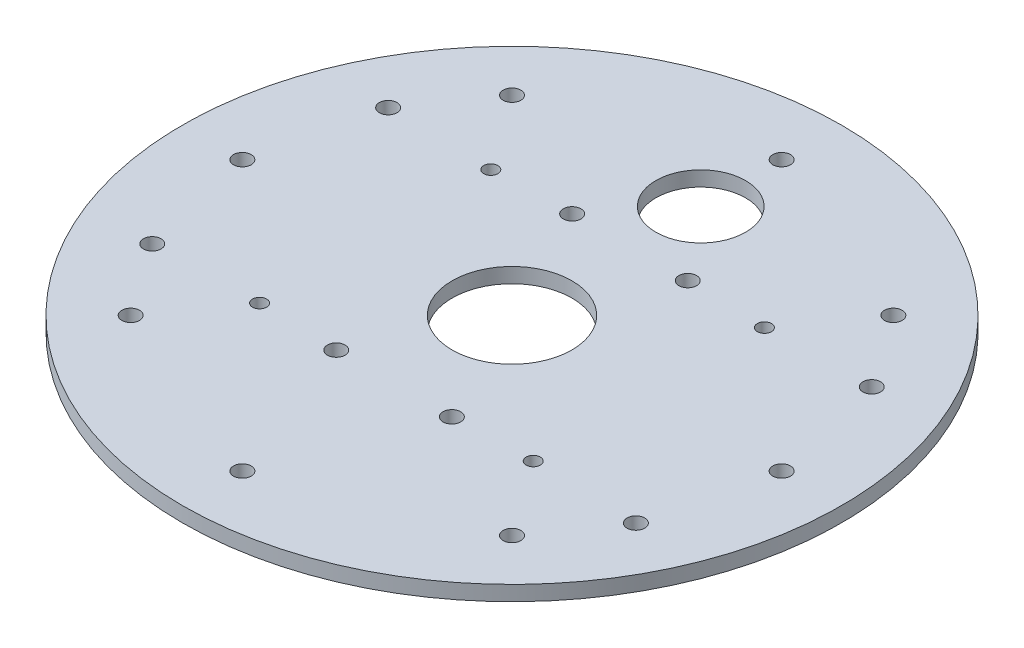
ISO-10303-21;
HEADER;
FILE_DESCRIPTION(('STEP AP214'),'2;1');
FILE_NAME('part.step','',(''),(''),'','','');
FILE_SCHEMA(('AUTOMOTIVE_DESIGN { 1 0 10303 214 1 1 1 1 }'));
ENDSEC;
DATA;
#1=APPLICATION_CONTEXT('core data for automotive mechanical design processes');
#2=APPLICATION_PROTOCOL_DEFINITION('international standard','automotive_design',2000,#1);
#3=PRODUCT_CONTEXT('',#1,'mechanical');
#4=PRODUCT('Part','Part','',(#3));
#5=PRODUCT_RELATED_PRODUCT_CATEGORY('part','',(#4));
#6=PRODUCT_DEFINITION_FORMATION('','',#4);
#7=PRODUCT_DEFINITION_CONTEXT('part definition',#1,'design');
#8=PRODUCT_DEFINITION('design','',#6,#7);
#9=PRODUCT_DEFINITION_SHAPE('','',#8);
#10=(LENGTH_UNIT() NAMED_UNIT(*) SI_UNIT(.MILLI.,.METRE.));
#11=(NAMED_UNIT(*) PLANE_ANGLE_UNIT() SI_UNIT($,.RADIAN.));
#12=(NAMED_UNIT(*) SI_UNIT($,.STERADIAN.) SOLID_ANGLE_UNIT());
#13=UNCERTAINTY_MEASURE_WITH_UNIT(LENGTH_MEASURE(1.E-05),#10,'distance_accuracy_value','');
#14=(GEOMETRIC_REPRESENTATION_CONTEXT(3) GLOBAL_UNCERTAINTY_ASSIGNED_CONTEXT((#13)) GLOBAL_UNIT_ASSIGNED_CONTEXT((#10,
#11,#12)) REPRESENTATION_CONTEXT('',''));
#15=CARTESIAN_POINT('',(0.,0.,0.));
#16=DIRECTION('',(0.,0.,1.));
#17=DIRECTION('',(1.,0.,0.));
#18=AXIS2_PLACEMENT_3D('',#15,#16,#17);
#19=CARTESIAN_POINT('',(0.,3.175,0.));
#20=DIRECTION('',(0.,-1.,0.));
#21=DIRECTION('',(0.,0.,-1.));
#22=AXIS2_PLACEMENT_3D('',#19,#20,#21);
#23=CYLINDRICAL_SURFACE('',#22,69.85);
#24=CARTESIAN_POINT('',(0.,3.175,0.));
#25=DIRECTION('',(0.,1.,0.));
#26=DIRECTION('',(0.,0.,1.));
#27=AXIS2_PLACEMENT_3D('',#24,#25,#26);
#28=CIRCLE('',#27,69.85);
#29=CARTESIAN_POINT('',(0.,3.175,69.85));
#30=VERTEX_POINT('',#29);
#31=EDGE_CURVE('E10',#30,#30,#28,.T.);
#32=ORIENTED_EDGE('',*,*,#31,.F.);
#33=EDGE_LOOP('',(#32));
#34=FACE_BOUND('',#33,.T.);
#35=CARTESIAN_POINT('',(0.,0.,0.));
#36=DIRECTION('',(0.,1.,0.));
#37=DIRECTION('',(0.,0.,1.));
#38=AXIS2_PLACEMENT_3D('',#35,#36,#37);
#39=CIRCLE('',#38,69.85);
#40=CARTESIAN_POINT('',(0.,0.,69.85));
#41=VERTEX_POINT('',#40);
#42=EDGE_CURVE('E34',#41,#41,#39,.T.);
#43=ORIENTED_EDGE('',*,*,#42,.T.);
#44=EDGE_LOOP('',(#43));
#45=FACE_BOUND('',#44,.T.);
#46=ADVANCED_FACE('F31',(#34,#45),#23,.T.);
#47=CARTESIAN_POINT('',(0.,3.175,0.));
#48=DIRECTION('',(0.,1.,0.));
#49=DIRECTION('',(0.,0.,1.));
#50=AXIS2_PLACEMENT_3D('',#47,#48,#49);
#51=PLANE('',#50);
#52=CARTESIAN_POINT('',(40.4111525448107,3.175,40.4111525448117));
#53=DIRECTION('',(0.,1.,0.));
#54=DIRECTION('',(0.,0.,1.));
#55=AXIS2_PLACEMENT_3D('',#52,#53,#54);
#56=CIRCLE('',#55,1.875);
#57=CARTESIAN_POINT('',(40.4111525448107,3.175,42.2861525448117));
#58=VERTEX_POINT('',#57);
#59=EDGE_CURVE('E140',#58,#58,#56,.F.);
#60=ORIENTED_EDGE('',*,*,#59,.T.);
#61=EDGE_LOOP('',(#60));
#62=FACE_BOUND('',#61,.T.);
#63=CARTESIAN_POINT('',(-29.,3.175,24.5));
#64=DIRECTION('',(0.,1.,0.));
#65=DIRECTION('',(0.,0.,1.));
#66=AXIS2_PLACEMENT_3D('',#63,#64,#65);
#67=CIRCLE('',#66,1.5);
#68=CARTESIAN_POINT('',(-29.,3.175,26.));
#69=VERTEX_POINT('',#68);
#70=EDGE_CURVE('E134',#69,#69,#67,.F.);
#71=ORIENTED_EDGE('',*,*,#70,.T.);
#72=EDGE_LOOP('',(#71));
#73=FACE_BOUND('',#72,.T.);
#74=CARTESIAN_POINT('',(5.26590217392525E-12,3.175,-57.1500000000019));
#75=DIRECTION('',(0.,1.,0.));
#76=DIRECTION('',(0.,0.,1.));
#77=AXIS2_PLACEMENT_3D('',#74,#75,#76);
#78=CIRCLE('',#77,1.875);
#79=CARTESIAN_POINT('',(5.26590217392525E-12,3.175,-55.2750000000019));
#80=VERTEX_POINT('',#79);
#81=EDGE_CURVE('E128',#80,#80,#78,.F.);
#82=ORIENTED_EDGE('',*,*,#81,.T.);
#83=EDGE_LOOP('',(#82));
#84=FACE_BOUND('',#83,.T.);
#85=CARTESIAN_POINT('',(-40.4111525448069,3.175,-40.4111525448155));
#86=DIRECTION('',(0.,1.,0.));
#87=DIRECTION('',(0.,0.,1.));
#88=AXIS2_PLACEMENT_3D('',#85,#86,#87);
#89=CIRCLE('',#88,1.875);
#90=CARTESIAN_POINT('',(-40.4111525448069,3.175,-38.5361525448155));
#91=VERTEX_POINT('',#90);
#92=EDGE_CURVE('E122',#91,#91,#89,.F.);
#93=ORIENTED_EDGE('',*,*,#92,.T.);
#94=EDGE_LOOP('',(#93));
#95=FACE_BOUND('',#94,.T.);
#96=CARTESIAN_POINT('',(-57.1499999999981,3.175,-5.27240738696016E-12));
#97=DIRECTION('',(0.,1.,0.));
#98=DIRECTION('',(0.,0.,1.));
#99=AXIS2_PLACEMENT_3D('',#96,#97,#98);
#100=CIRCLE('',#99,1.875);
#101=CARTESIAN_POINT('',(-57.1499999999981,3.175,1.87499999999473));
#102=VERTEX_POINT('',#101);
#103=EDGE_CURVE('E115',#102,#102,#100,.F.);
#104=ORIENTED_EDGE('',*,*,#103,.T.);
#105=EDGE_LOOP('',(#104));
#106=FACE_BOUND('',#105,.T.);
#107=CARTESIAN_POINT('',(-40.4111525448117,3.175,40.4111525448069));
#108=DIRECTION('',(0.,1.,0.));
#109=DIRECTION('',(0.,0.,1.));
#110=AXIS2_PLACEMENT_3D('',#107,#108,#109);
#111=CIRCLE('',#110,1.875);
#112=CARTESIAN_POINT('',(-40.4111525448117,3.175,42.2861525448069));
#113=VERTEX_POINT('',#112);
#114=EDGE_CURVE('E169',#113,#113,#111,.F.);
#115=ORIENTED_EDGE('',*,*,#114,.T.);
#116=EDGE_LOOP('',(#115));
#117=FACE_BOUND('',#116,.T.);
#118=CARTESIAN_POINT('',(-1.50372063540055E-12,3.175,57.1499999999981));
#119=DIRECTION('',(0.,1.,0.));
#120=DIRECTION('',(0.,0.,1.));
#121=AXIS2_PLACEMENT_3D('',#118,#119,#120);
#122=CIRCLE('',#121,1.875);
#123=CARTESIAN_POINT('',(-1.50372063540055E-12,3.175,59.0249999999981));
#124=VERTEX_POINT('',#123);
#125=EDGE_CURVE('E163',#124,#124,#122,.F.);
#126=ORIENTED_EDGE('',*,*,#125,.T.);
#127=EDGE_LOOP('',(#126));
#128=FACE_BOUND('',#127,.T.);
#129=CARTESIAN_POINT('',(29.,3.175,24.5));
#130=DIRECTION('',(0.,1.,0.));
#131=DIRECTION('',(0.,0.,1.));
#132=AXIS2_PLACEMENT_3D('',#129,#130,#131);
#133=CIRCLE('',#132,1.5);
#134=CARTESIAN_POINT('',(29.,3.175,26.));
#135=VERTEX_POINT('',#134);
#136=EDGE_CURVE('E157',#135,#135,#133,.F.);
#137=ORIENTED_EDGE('',*,*,#136,.T.);
#138=EDGE_LOOP('',(#137));
#139=FACE_BOUND('',#138,.T.);
#140=CARTESIAN_POINT('',(29.,3.175,-24.5));
#141=DIRECTION('',(0.,1.,0.));
#142=DIRECTION('',(0.,0.,1.));
#143=AXIS2_PLACEMENT_3D('',#140,#141,#142);
#144=CIRCLE('',#143,1.5);
#145=CARTESIAN_POINT('',(29.,3.175,-23.));
#146=VERTEX_POINT('',#145);
#147=EDGE_CURVE('E151',#146,#146,#144,.F.);
#148=ORIENTED_EDGE('',*,*,#147,.T.);
#149=EDGE_LOOP('',(#148));
#150=FACE_BOUND('',#149,.T.);
#151=CARTESIAN_POINT('',(0.,3.175,-40.));
#152=DIRECTION('',(0.,1.,0.));
#153=DIRECTION('',(0.,0.,1.));
#154=AXIS2_PLACEMENT_3D('',#151,#152,#153);
#155=CIRCLE('',#154,9.5);
#156=CARTESIAN_POINT('',(0.,3.175,-30.5));
#157=VERTEX_POINT('',#156);
#158=EDGE_CURVE('E145',#157,#157,#155,.F.);
#159=ORIENTED_EDGE('',*,*,#158,.T.);
#160=EDGE_LOOP('',(#159));
#161=FACE_BOUND('',#160,.T.);
#162=CARTESIAN_POINT('',(12.25,3.175,-25.));
#163=DIRECTION('',(0.,1.,0.));
#164=DIRECTION('',(0.,0.,1.));
#165=AXIS2_PLACEMENT_3D('',#162,#163,#164);
#166=CIRCLE('',#165,1.875);
#167=CARTESIAN_POINT('',(12.25,3.175,-23.125));
#168=VERTEX_POINT('',#167);
#169=EDGE_CURVE('E62',#168,#168,#166,.F.);
#170=ORIENTED_EDGE('',*,*,#169,.T.);
#171=EDGE_LOOP('',(#170));
#172=FACE_BOUND('',#171,.T.);
#173=CARTESIAN_POINT('',(51.2500000000002,3.175,-25.));
#174=DIRECTION('',(0.,1.,0.));
#175=DIRECTION('',(0.,0.,1.));
#176=AXIS2_PLACEMENT_3D('',#173,#174,#175);
#177=CIRCLE('',#176,1.875);
#178=CARTESIAN_POINT('',(51.2500000000002,3.175,-23.125));
#179=VERTEX_POINT('',#178);
#180=EDGE_CURVE('E55',#179,#179,#177,.F.);
#181=ORIENTED_EDGE('',*,*,#180,.T.);
#182=EDGE_LOOP('',(#181));
#183=FACE_BOUND('',#182,.T.);
#184=CARTESIAN_POINT('',(51.2500000000002,3.175,25.));
#185=DIRECTION('',(0.,1.,0.));
#186=DIRECTION('',(0.,0.,1.));
#187=AXIS2_PLACEMENT_3D('',#184,#185,#186);
#188=CIRCLE('',#187,1.875);
#189=CARTESIAN_POINT('',(51.2500000000002,3.175,26.875));
#190=VERTEX_POINT('',#189);
#191=EDGE_CURVE('E82',#190,#190,#188,.F.);
#192=ORIENTED_EDGE('',*,*,#191,.T.);
#193=EDGE_LOOP('',(#192));
#194=FACE_BOUND('',#193,.T.);
#195=CARTESIAN_POINT('',(12.25,3.175,25.));
#196=DIRECTION('',(0.,1.,0.));
#197=DIRECTION('',(0.,0.,1.));
#198=AXIS2_PLACEMENT_3D('',#195,#196,#197);
#199=CIRCLE('',#198,1.875);
#200=CARTESIAN_POINT('',(12.25,3.175,26.875));
#201=VERTEX_POINT('',#200);
#202=EDGE_CURVE('E76',#201,#201,#199,.F.);
#203=ORIENTED_EDGE('',*,*,#202,.T.);
#204=EDGE_LOOP('',(#203));
#205=FACE_BOUND('',#204,.T.);
#206=CARTESIAN_POINT('',(40.4111525448155,3.175,-40.4111525448107));
#207=DIRECTION('',(0.,1.,0.));
#208=DIRECTION('',(0.,0.,1.));
#209=AXIS2_PLACEMENT_3D('',#206,#207,#208);
#210=CIRCLE('',#209,1.875);
#211=CARTESIAN_POINT('',(40.4111525448155,3.175,-38.5361525448107));
#212=VERTEX_POINT('',#211);
#213=EDGE_CURVE('E69',#212,#212,#210,.F.);
#214=ORIENTED_EDGE('',*,*,#213,.T.);
#215=EDGE_LOOP('',(#214));
#216=FACE_BOUND('',#215,.T.);
#217=CARTESIAN_POINT('',(-29.,3.175,-24.5));
#218=DIRECTION('',(0.,1.,0.));
#219=DIRECTION('',(0.,0.,1.));
#220=AXIS2_PLACEMENT_3D('',#217,#218,#219);
#221=CIRCLE('',#220,1.5);
#222=CARTESIAN_POINT('',(-29.,3.175,-23.));
#223=VERTEX_POINT('',#222);
#224=EDGE_CURVE('E87',#223,#223,#221,.F.);
#225=ORIENTED_EDGE('',*,*,#224,.T.);
#226=EDGE_LOOP('',(#225));
#227=FACE_BOUND('',#226,.T.);
#228=CARTESIAN_POINT('',(-51.2500000000002,3.175,-25.));
#229=DIRECTION('',(0.,1.,0.));
#230=DIRECTION('',(0.,0.,1.));
#231=AXIS2_PLACEMENT_3D('',#228,#229,#230);
#232=CIRCLE('',#231,1.875);
#233=CARTESIAN_POINT('',(-51.2500000000002,3.175,-23.125));
#234=VERTEX_POINT('',#233);
#235=EDGE_CURVE('E100',#234,#234,#232,.F.);
#236=ORIENTED_EDGE('',*,*,#235,.T.);
#237=EDGE_LOOP('',(#236));
#238=FACE_BOUND('',#237,.T.);
#239=CARTESIAN_POINT('',(-12.25,3.175,-25.));
#240=DIRECTION('',(0.,1.,0.));
#241=DIRECTION('',(0.,0.,1.));
#242=AXIS2_PLACEMENT_3D('',#239,#240,#241);
#243=CIRCLE('',#242,1.875);
#244=CARTESIAN_POINT('',(-12.25,3.175,-23.125));
#245=VERTEX_POINT('',#244);
#246=EDGE_CURVE('E68',#245,#245,#243,.F.);
#247=ORIENTED_EDGE('',*,*,#246,.T.);
#248=EDGE_LOOP('',(#247));
#249=FACE_BOUND('',#248,.T.);
#250=CARTESIAN_POINT('',(-51.2500000000002,3.175,25.));
#251=DIRECTION('',(0.,1.,0.));
#252=DIRECTION('',(0.,0.,1.));
#253=AXIS2_PLACEMENT_3D('',#250,#251,#252);
#254=CIRCLE('',#253,1.875);
#255=CARTESIAN_POINT('',(-51.2500000000002,3.175,26.875));
#256=VERTEX_POINT('',#255);
#257=EDGE_CURVE('E94',#256,#256,#254,.F.);
#258=ORIENTED_EDGE('',*,*,#257,.T.);
#259=EDGE_LOOP('',(#258));
#260=FACE_BOUND('',#259,.T.);
#261=CARTESIAN_POINT('',(-12.25,3.175,25.));
#262=DIRECTION('',(0.,1.,0.));
#263=DIRECTION('',(0.,0.,1.));
#264=AXIS2_PLACEMENT_3D('',#261,#262,#263);
#265=CIRCLE('',#264,1.875);
#266=CARTESIAN_POINT('',(-12.25,3.175,26.875));
#267=VERTEX_POINT('',#266);
#268=EDGE_CURVE('E110',#267,#267,#265,.F.);
#269=ORIENTED_EDGE('',*,*,#268,.T.);
#270=EDGE_LOOP('',(#269));
#271=FACE_BOUND('',#270,.T.);
#272=CARTESIAN_POINT('',(57.1500000000019,3.175,1.48628345681095E-12));
#273=DIRECTION('',(0.,1.,0.));
#274=DIRECTION('',(0.,0.,1.));
#275=AXIS2_PLACEMENT_3D('',#272,#273,#274);
#276=CIRCLE('',#275,1.875);
#277=CARTESIAN_POINT('',(57.1500000000019,3.175,1.87500000000149));
#278=VERTEX_POINT('',#277);
#279=EDGE_CURVE('E49',#278,#278,#276,.F.);
#280=ORIENTED_EDGE('',*,*,#279,.T.);
#281=EDGE_LOOP('',(#280));
#282=FACE_BOUND('',#281,.T.);
#283=CARTESIAN_POINT('',(0.,3.175,0.));
#284=DIRECTION('',(0.,1.,0.));
#285=DIRECTION('',(0.,0.,1.));
#286=AXIS2_PLACEMENT_3D('',#283,#284,#285);
#287=CIRCLE('',#286,12.7);
#288=CARTESIAN_POINT('',(0.,3.175,12.7));
#289=VERTEX_POINT('',#288);
#290=EDGE_CURVE('E43',#289,#289,#287,.F.);
#291=ORIENTED_EDGE('',*,*,#290,.T.);
#292=EDGE_LOOP('',(#291));
#293=FACE_BOUND('',#292,.T.);
#294=ORIENTED_EDGE('',*,*,#31,.T.);
#295=EDGE_LOOP('',(#294));
#296=FACE_BOUND('',#295,.T.);
#297=ADVANCED_FACE('F181',(#62,#73,#84,#95,#106,#117,#128,#139,#150,#161,#172,#183,#194,#205,
#216,#227,#238,#249,#260,#271,#282,#293,#296),#51,.T.);
#298=CARTESIAN_POINT('',(0.,0.,0.));
#299=DIRECTION('',(0.,1.,0.));
#300=DIRECTION('',(0.,0.,1.));
#301=AXIS2_PLACEMENT_3D('',#298,#299,#300);
#302=PLANE('',#301);
#303=CARTESIAN_POINT('',(40.4111525448107,0.,40.4111525448117));
#304=DIRECTION('',(0.,-1.,0.));
#305=DIRECTION('',(0.,0.,-1.));
#306=AXIS2_PLACEMENT_3D('',#303,#304,#305);
#307=CIRCLE('',#306,1.875);
#308=CARTESIAN_POINT('',(40.4111525448107,0.,38.5361525448117));
#309=VERTEX_POINT('',#308);
#310=EDGE_CURVE('E73',#309,#309,#307,.T.);
#311=ORIENTED_EDGE('',*,*,#310,.F.);
#312=EDGE_LOOP('',(#311));
#313=FACE_BOUND('',#312,.T.);
#314=CARTESIAN_POINT('',(-29.,0.,24.5));
#315=DIRECTION('',(0.,-1.,0.));
#316=DIRECTION('',(0.,0.,1.));
#317=AXIS2_PLACEMENT_3D('',#314,#315,#316);
#318=CIRCLE('',#317,1.5);
#319=CARTESIAN_POINT('',(-29.,0.,26.));
#320=VERTEX_POINT('',#319);
#321=EDGE_CURVE('E137',#320,#320,#318,.T.);
#322=ORIENTED_EDGE('',*,*,#321,.F.);
#323=EDGE_LOOP('',(#322));
#324=FACE_BOUND('',#323,.T.);
#325=CARTESIAN_POINT('',(5.26590217392525E-12,0.,-57.1500000000019));
#326=DIRECTION('',(0.,-1.,0.));
#327=DIRECTION('',(0.,0.,-1.));
#328=AXIS2_PLACEMENT_3D('',#325,#326,#327);
#329=CIRCLE('',#328,1.875);
#330=CARTESIAN_POINT('',(5.26590217392525E-12,0.,-59.0250000000019));
#331=VERTEX_POINT('',#330);
#332=EDGE_CURVE('E131',#331,#331,#329,.T.);
#333=ORIENTED_EDGE('',*,*,#332,.F.);
#334=EDGE_LOOP('',(#333));
#335=FACE_BOUND('',#334,.T.);
#336=CARTESIAN_POINT('',(-40.4111525448069,0.,-40.4111525448155));
#337=DIRECTION('',(0.,-1.,0.));
#338=DIRECTION('',(0.,0.,-1.));
#339=AXIS2_PLACEMENT_3D('',#336,#337,#338);
#340=CIRCLE('',#339,1.875);
#341=CARTESIAN_POINT('',(-40.4111525448069,0.,-42.2861525448155));
#342=VERTEX_POINT('',#341);
#343=EDGE_CURVE('E125',#342,#342,#340,.T.);
#344=ORIENTED_EDGE('',*,*,#343,.F.);
#345=EDGE_LOOP('',(#344));
#346=FACE_BOUND('',#345,.T.);
#347=CARTESIAN_POINT('',(-57.1499999999981,0.,-5.27240738696016E-12));
#348=DIRECTION('',(0.,-1.,0.));
#349=DIRECTION('',(0.,0.,-1.));
#350=AXIS2_PLACEMENT_3D('',#347,#348,#349);
#351=CIRCLE('',#350,1.875);
#352=CARTESIAN_POINT('',(-57.1499999999981,0.,-1.87500000000528));
#353=VERTEX_POINT('',#352);
#354=EDGE_CURVE('E118',#353,#353,#351,.T.);
#355=ORIENTED_EDGE('',*,*,#354,.F.);
#356=EDGE_LOOP('',(#355));
#357=FACE_BOUND('',#356,.T.);
#358=CARTESIAN_POINT('',(-40.4111525448117,0.,40.4111525448069));
#359=DIRECTION('',(0.,-1.,0.));
#360=DIRECTION('',(0.,0.,-1.));
#361=AXIS2_PLACEMENT_3D('',#358,#359,#360);
#362=CIRCLE('',#361,1.875);
#363=CARTESIAN_POINT('',(-40.4111525448117,0.,38.5361525448069));
#364=VERTEX_POINT('',#363);
#365=EDGE_CURVE('E119',#364,#364,#362,.T.);
#366=ORIENTED_EDGE('',*,*,#365,.F.);
#367=EDGE_LOOP('',(#366));
#368=FACE_BOUND('',#367,.T.);
#369=CARTESIAN_POINT('',(-1.50372063540055E-12,0.,57.1499999999981));
#370=DIRECTION('',(0.,-1.,0.));
#371=DIRECTION('',(0.,0.,-1.));
#372=AXIS2_PLACEMENT_3D('',#369,#370,#371);
#373=CIRCLE('',#372,1.875);
#374=CARTESIAN_POINT('',(-1.50372063540055E-12,0.,55.2749999999981));
#375=VERTEX_POINT('',#374);
#376=EDGE_CURVE('E166',#375,#375,#373,.T.);
#377=ORIENTED_EDGE('',*,*,#376,.F.);
#378=EDGE_LOOP('',(#377));
#379=FACE_BOUND('',#378,.T.);
#380=CARTESIAN_POINT('',(29.,0.,24.5));
#381=DIRECTION('',(0.,-1.,0.));
#382=DIRECTION('',(0.,0.,-1.));
#383=AXIS2_PLACEMENT_3D('',#380,#381,#382);
#384=CIRCLE('',#383,1.5);
#385=CARTESIAN_POINT('',(29.,0.,23.));
#386=VERTEX_POINT('',#385);
#387=EDGE_CURVE('E160',#386,#386,#384,.T.);
#388=ORIENTED_EDGE('',*,*,#387,.F.);
#389=EDGE_LOOP('',(#388));
#390=FACE_BOUND('',#389,.T.);
#391=CARTESIAN_POINT('',(29.,0.,-24.5));
#392=DIRECTION('',(0.,-1.,0.));
#393=DIRECTION('',(0.,0.,1.));
#394=AXIS2_PLACEMENT_3D('',#391,#392,#393);
#395=CIRCLE('',#394,1.5);
#396=CARTESIAN_POINT('',(29.,0.,-23.));
#397=VERTEX_POINT('',#396);
#398=EDGE_CURVE('E154',#397,#397,#395,.T.);
#399=ORIENTED_EDGE('',*,*,#398,.F.);
#400=EDGE_LOOP('',(#399));
#401=FACE_BOUND('',#400,.T.);
#402=CARTESIAN_POINT('',(0.,0.,-40.));
#403=DIRECTION('',(0.,-1.,0.));
#404=DIRECTION('',(0.,0.,-1.));
#405=AXIS2_PLACEMENT_3D('',#402,#403,#404);
#406=CIRCLE('',#405,9.5);
#407=CARTESIAN_POINT('',(0.,0.,-49.5));
#408=VERTEX_POINT('',#407);
#409=EDGE_CURVE('E148',#408,#408,#406,.T.);
#410=ORIENTED_EDGE('',*,*,#409,.F.);
#411=EDGE_LOOP('',(#410));
#412=FACE_BOUND('',#411,.T.);
#413=CARTESIAN_POINT('',(12.25,0.,-25.));
#414=DIRECTION('',(0.,-1.,0.));
#415=DIRECTION('',(0.,0.,-1.));
#416=AXIS2_PLACEMENT_3D('',#413,#414,#415);
#417=CIRCLE('',#416,1.875);
#418=CARTESIAN_POINT('',(12.25,0.,-26.875));
#419=VERTEX_POINT('',#418);
#420=EDGE_CURVE('E65',#419,#419,#417,.T.);
#421=ORIENTED_EDGE('',*,*,#420,.F.);
#422=EDGE_LOOP('',(#421));
#423=FACE_BOUND('',#422,.T.);
#424=CARTESIAN_POINT('',(51.2500000000002,0.,-25.));
#425=DIRECTION('',(0.,-1.,0.));
#426=DIRECTION('',(0.,0.,1.));
#427=AXIS2_PLACEMENT_3D('',#424,#425,#426);
#428=CIRCLE('',#427,1.875);
#429=CARTESIAN_POINT('',(51.2500000000002,0.,-23.125));
#430=VERTEX_POINT('',#429);
#431=EDGE_CURVE('E58',#430,#430,#428,.T.);
#432=ORIENTED_EDGE('',*,*,#431,.F.);
#433=EDGE_LOOP('',(#432));
#434=FACE_BOUND('',#433,.T.);
#435=CARTESIAN_POINT('',(51.2500000000002,0.,25.));
#436=DIRECTION('',(0.,-1.,0.));
#437=DIRECTION('',(0.,0.,-1.));
#438=AXIS2_PLACEMENT_3D('',#435,#436,#437);
#439=CIRCLE('',#438,1.875);
#440=CARTESIAN_POINT('',(51.2500000000002,0.,23.125));
#441=VERTEX_POINT('',#440);
#442=EDGE_CURVE('E59',#441,#441,#439,.T.);
#443=ORIENTED_EDGE('',*,*,#442,.F.);
#444=EDGE_LOOP('',(#443));
#445=FACE_BOUND('',#444,.T.);
#446=CARTESIAN_POINT('',(12.25,0.,25.));
#447=DIRECTION('',(0.,-1.,0.));
#448=DIRECTION('',(0.,0.,1.));
#449=AXIS2_PLACEMENT_3D('',#446,#447,#448);
#450=CIRCLE('',#449,1.875);
#451=CARTESIAN_POINT('',(12.25,0.,26.875));
#452=VERTEX_POINT('',#451);
#453=EDGE_CURVE('E79',#452,#452,#450,.T.);
#454=ORIENTED_EDGE('',*,*,#453,.F.);
#455=EDGE_LOOP('',(#454));
#456=FACE_BOUND('',#455,.T.);
#457=CARTESIAN_POINT('',(40.4111525448155,0.,-40.4111525448107));
#458=DIRECTION('',(0.,-1.,0.));
#459=DIRECTION('',(0.,0.,-1.));
#460=AXIS2_PLACEMENT_3D('',#457,#458,#459);
#461=CIRCLE('',#460,1.875);
#462=CARTESIAN_POINT('',(40.4111525448155,0.,-42.2861525448107));
#463=VERTEX_POINT('',#462);
#464=EDGE_CURVE('E72',#463,#463,#461,.T.);
#465=ORIENTED_EDGE('',*,*,#464,.F.);
#466=EDGE_LOOP('',(#465));
#467=FACE_BOUND('',#466,.T.);
#468=CARTESIAN_POINT('',(-29.,0.,-24.5));
#469=DIRECTION('',(0.,-1.,0.));
#470=DIRECTION('',(0.,0.,-1.));
#471=AXIS2_PLACEMENT_3D('',#468,#469,#470);
#472=CIRCLE('',#471,1.5);
#473=CARTESIAN_POINT('',(-29.,0.,-26.));
#474=VERTEX_POINT('',#473);
#475=EDGE_CURVE('E90',#474,#474,#472,.T.);
#476=ORIENTED_EDGE('',*,*,#475,.F.);
#477=EDGE_LOOP('',(#476));
#478=FACE_BOUND('',#477,.T.);
#479=CARTESIAN_POINT('',(-51.2500000000002,0.,-25.));
#480=DIRECTION('',(0.,-1.,0.));
#481=DIRECTION('',(0.,0.,-1.));
#482=AXIS2_PLACEMENT_3D('',#479,#480,#481);
#483=CIRCLE('',#482,1.875);
#484=CARTESIAN_POINT('',(-51.2500000000002,0.,-26.875));
#485=VERTEX_POINT('',#484);
#486=EDGE_CURVE('E91',#485,#485,#483,.T.);
#487=ORIENTED_EDGE('',*,*,#486,.F.);
#488=EDGE_LOOP('',(#487));
#489=FACE_BOUND('',#488,.T.);
#490=CARTESIAN_POINT('',(-12.25,0.,-25.));
#491=DIRECTION('',(0.,-1.,0.));
#492=DIRECTION('',(0.,0.,1.));
#493=AXIS2_PLACEMENT_3D('',#490,#491,#492);
#494=CIRCLE('',#493,1.875);
#495=CARTESIAN_POINT('',(-12.25,0.,-23.125));
#496=VERTEX_POINT('',#495);
#497=EDGE_CURVE('E97',#496,#496,#494,.T.);
#498=ORIENTED_EDGE('',*,*,#497,.F.);
#499=EDGE_LOOP('',(#498));
#500=FACE_BOUND('',#499,.T.);
#501=CARTESIAN_POINT('',(-51.2500000000002,0.,25.));
#502=DIRECTION('',(0.,-1.,0.));
#503=DIRECTION('',(0.,0.,1.));
#504=AXIS2_PLACEMENT_3D('',#501,#502,#503);
#505=CIRCLE('',#504,1.875);
#506=CARTESIAN_POINT('',(-51.2500000000002,0.,26.875));
#507=VERTEX_POINT('',#506);
#508=EDGE_CURVE('E107',#507,#507,#505,.T.);
#509=ORIENTED_EDGE('',*,*,#508,.F.);
#510=EDGE_LOOP('',(#509));
#511=FACE_BOUND('',#510,.T.);
#512=CARTESIAN_POINT('',(-12.25,0.,25.));
#513=DIRECTION('',(0.,-1.,0.));
#514=DIRECTION('',(0.,0.,-1.));
#515=AXIS2_PLACEMENT_3D('',#512,#513,#514);
#516=CIRCLE('',#515,1.875);
#517=CARTESIAN_POINT('',(-12.25,0.,23.125));
#518=VERTEX_POINT('',#517);
#519=EDGE_CURVE('E52',#518,#518,#516,.T.);
#520=ORIENTED_EDGE('',*,*,#519,.F.);
#521=EDGE_LOOP('',(#520));
#522=FACE_BOUND('',#521,.T.);
#523=CARTESIAN_POINT('',(57.1500000000019,0.,1.48628345681095E-12));
#524=DIRECTION('',(0.,-1.,0.));
#525=DIRECTION('',(0.,0.,-1.));
#526=AXIS2_PLACEMENT_3D('',#523,#524,#525);
#527=CIRCLE('',#526,1.875);
#528=CARTESIAN_POINT('',(57.1500000000019,0.,-1.87499999999852));
#529=VERTEX_POINT('',#528);
#530=EDGE_CURVE('E46',#529,#529,#527,.T.);
#531=ORIENTED_EDGE('',*,*,#530,.F.);
#532=EDGE_LOOP('',(#531));
#533=FACE_BOUND('',#532,.T.);
#534=CARTESIAN_POINT('',(0.,0.,0.));
#535=DIRECTION('',(0.,-1.,0.));
#536=DIRECTION('',(0.,0.,-1.));
#537=AXIS2_PLACEMENT_3D('',#534,#535,#536);
#538=CIRCLE('',#537,12.7);
#539=CARTESIAN_POINT('',(0.,0.,-12.7));
#540=VERTEX_POINT('',#539);
#541=EDGE_CURVE('E41',#540,#540,#538,.T.);
#542=ORIENTED_EDGE('',*,*,#541,.F.);
#543=EDGE_LOOP('',(#542));
#544=FACE_BOUND('',#543,.T.);
#545=ORIENTED_EDGE('',*,*,#42,.F.);
#546=EDGE_LOOP('',(#545));
#547=FACE_BOUND('',#546,.T.);
#548=ADVANCED_FACE('F177',(#313,#324,#335,#346,#357,#368,#379,#390,#401,#412,#423,#434,#445,
#456,#467,#478,#489,#500,#511,#522,#533,#544,#547),#302,.F.);
#549=CARTESIAN_POINT('',(0.,3.176,0.));
#550=DIRECTION('',(0.,-1.,0.));
#551=DIRECTION('',(0.,0.,-1.));
#552=AXIS2_PLACEMENT_3D('',#549,#550,#551);
#553=CYLINDRICAL_SURFACE('',#552,12.7);
#554=ORIENTED_EDGE('',*,*,#290,.F.);
#555=EDGE_LOOP('',(#554));
#556=FACE_BOUND('',#555,.T.);
#557=ORIENTED_EDGE('',*,*,#541,.T.);
#558=EDGE_LOOP('',(#557));
#559=FACE_BOUND('',#558,.T.);
#560=ADVANCED_FACE('F180',(#556,#559),#553,.F.);
#561=CARTESIAN_POINT('',(57.1500000000019,3.176,1.48628345681095E-12));
#562=DIRECTION('',(0.,-1.,0.));
#563=DIRECTION('',(0.,0.,-1.));
#564=AXIS2_PLACEMENT_3D('',#561,#562,#563);
#565=CYLINDRICAL_SURFACE('',#564,1.875);
#566=ORIENTED_EDGE('',*,*,#279,.F.);
#567=EDGE_LOOP('',(#566));
#568=FACE_BOUND('',#567,.T.);
#569=ORIENTED_EDGE('',*,*,#530,.T.);
#570=EDGE_LOOP('',(#569));
#571=FACE_BOUND('',#570,.T.);
#572=ADVANCED_FACE('F230',(#568,#571),#565,.F.);
#573=CARTESIAN_POINT('',(-12.25,3.176,25.));
#574=DIRECTION('',(0.,-1.,0.));
#575=DIRECTION('',(0.,0.,-1.));
#576=AXIS2_PLACEMENT_3D('',#573,#574,#575);
#577=CYLINDRICAL_SURFACE('',#576,1.875);
#578=ORIENTED_EDGE('',*,*,#268,.F.);
#579=EDGE_LOOP('',(#578));
#580=FACE_BOUND('',#579,.T.);
#581=ORIENTED_EDGE('',*,*,#519,.T.);
#582=EDGE_LOOP('',(#581));
#583=FACE_BOUND('',#582,.T.);
#584=ADVANCED_FACE('F234',(#580,#583),#577,.F.);
#585=CARTESIAN_POINT('',(-51.2500000000002,3.176,25.));
#586=DIRECTION('',(0.,-1.,0.));
#587=DIRECTION('',(0.,0.,-1.));
#588=AXIS2_PLACEMENT_3D('',#585,#586,#587);
#589=CYLINDRICAL_SURFACE('',#588,1.875);
#590=ORIENTED_EDGE('',*,*,#257,.F.);
#591=EDGE_LOOP('',(#590));
#592=FACE_BOUND('',#591,.T.);
#593=ORIENTED_EDGE('',*,*,#508,.T.);
#594=EDGE_LOOP('',(#593));
#595=FACE_BOUND('',#594,.T.);
#596=ADVANCED_FACE('F265',(#592,#595),#589,.F.);
#597=CARTESIAN_POINT('',(-12.25,3.176,-25.));
#598=DIRECTION('',(0.,-1.,0.));
#599=DIRECTION('',(0.,0.,-1.));
#600=AXIS2_PLACEMENT_3D('',#597,#598,#599);
#601=CYLINDRICAL_SURFACE('',#600,1.875);
#602=ORIENTED_EDGE('',*,*,#246,.F.);
#603=EDGE_LOOP('',(#602));
#604=FACE_BOUND('',#603,.T.);
#605=ORIENTED_EDGE('',*,*,#497,.T.);
#606=EDGE_LOOP('',(#605));
#607=FACE_BOUND('',#606,.T.);
#608=ADVANCED_FACE('F262',(#604,#607),#601,.F.);
#609=CARTESIAN_POINT('',(-51.2500000000002,3.176,-25.));
#610=DIRECTION('',(0.,-1.,0.));
#611=DIRECTION('',(0.,0.,-1.));
#612=AXIS2_PLACEMENT_3D('',#609,#610,#611);
#613=CYLINDRICAL_SURFACE('',#612,1.875);
#614=ORIENTED_EDGE('',*,*,#235,.F.);
#615=EDGE_LOOP('',(#614));
#616=FACE_BOUND('',#615,.T.);
#617=ORIENTED_EDGE('',*,*,#486,.T.);
#618=EDGE_LOOP('',(#617));
#619=FACE_BOUND('',#618,.T.);
#620=ADVANCED_FACE('F260',(#616,#619),#613,.F.);
#621=CARTESIAN_POINT('',(-29.,3.176,-24.5));
#622=DIRECTION('',(0.,-1.,0.));
#623=DIRECTION('',(0.,0.,-1.));
#624=AXIS2_PLACEMENT_3D('',#621,#622,#623);
#625=CYLINDRICAL_SURFACE('',#624,1.5);
#626=ORIENTED_EDGE('',*,*,#224,.F.);
#627=EDGE_LOOP('',(#626));
#628=FACE_BOUND('',#627,.T.);
#629=ORIENTED_EDGE('',*,*,#475,.T.);
#630=EDGE_LOOP('',(#629));
#631=FACE_BOUND('',#630,.T.);
#632=ADVANCED_FACE('F250',(#628,#631),#625,.F.);
#633=CARTESIAN_POINT('',(40.4111525448155,3.176,-40.4111525448107));
#634=DIRECTION('',(0.,-1.,0.));
#635=DIRECTION('',(0.,0.,-1.));
#636=AXIS2_PLACEMENT_3D('',#633,#634,#635);
#637=CYLINDRICAL_SURFACE('',#636,1.875);
#638=ORIENTED_EDGE('',*,*,#213,.F.);
#639=EDGE_LOOP('',(#638));
#640=FACE_BOUND('',#639,.T.);
#641=ORIENTED_EDGE('',*,*,#464,.T.);
#642=EDGE_LOOP('',(#641));
#643=FACE_BOUND('',#642,.T.);
#644=ADVANCED_FACE('F246',(#640,#643),#637,.F.);
#645=CARTESIAN_POINT('',(12.25,3.176,25.));
#646=DIRECTION('',(0.,-1.,0.));
#647=DIRECTION('',(0.,0.,-1.));
#648=AXIS2_PLACEMENT_3D('',#645,#646,#647);
#649=CYLINDRICAL_SURFACE('',#648,1.875);
#650=ORIENTED_EDGE('',*,*,#202,.F.);
#651=EDGE_LOOP('',(#650));
#652=FACE_BOUND('',#651,.T.);
#653=ORIENTED_EDGE('',*,*,#453,.T.);
#654=EDGE_LOOP('',(#653));
#655=FACE_BOUND('',#654,.T.);
#656=ADVANCED_FACE('F249',(#652,#655),#649,.F.);
#657=CARTESIAN_POINT('',(51.2500000000002,3.176,25.));
#658=DIRECTION('',(0.,-1.,0.));
#659=DIRECTION('',(0.,0.,-1.));
#660=AXIS2_PLACEMENT_3D('',#657,#658,#659);
#661=CYLINDRICAL_SURFACE('',#660,1.875);
#662=ORIENTED_EDGE('',*,*,#191,.F.);
#663=EDGE_LOOP('',(#662));
#664=FACE_BOUND('',#663,.T.);
#665=ORIENTED_EDGE('',*,*,#442,.T.);
#666=EDGE_LOOP('',(#665));
#667=FACE_BOUND('',#666,.T.);
#668=ADVANCED_FACE('F240',(#664,#667),#661,.F.);
#669=CARTESIAN_POINT('',(51.2500000000002,3.176,-25.));
#670=DIRECTION('',(0.,-1.,0.));
#671=DIRECTION('',(0.,0.,-1.));
#672=AXIS2_PLACEMENT_3D('',#669,#670,#671);
#673=CYLINDRICAL_SURFACE('',#672,1.875);
#674=ORIENTED_EDGE('',*,*,#180,.F.);
#675=EDGE_LOOP('',(#674));
#676=FACE_BOUND('',#675,.T.);
#677=ORIENTED_EDGE('',*,*,#431,.T.);
#678=EDGE_LOOP('',(#677));
#679=FACE_BOUND('',#678,.T.);
#680=ADVANCED_FACE('F236',(#676,#679),#673,.F.);
#681=CARTESIAN_POINT('',(12.25,3.176,-25.));
#682=DIRECTION('',(0.,-1.,0.));
#683=DIRECTION('',(0.,0.,-1.));
#684=AXIS2_PLACEMENT_3D('',#681,#682,#683);
#685=CYLINDRICAL_SURFACE('',#684,1.875);
#686=ORIENTED_EDGE('',*,*,#169,.F.);
#687=EDGE_LOOP('',(#686));
#688=FACE_BOUND('',#687,.T.);
#689=ORIENTED_EDGE('',*,*,#420,.T.);
#690=EDGE_LOOP('',(#689));
#691=FACE_BOUND('',#690,.T.);
#692=ADVANCED_FACE('F239',(#688,#691),#685,.F.);
#693=CARTESIAN_POINT('',(0.,3.176,-40.));
#694=DIRECTION('',(0.,-1.,0.));
#695=DIRECTION('',(0.,0.,-1.));
#696=AXIS2_PLACEMENT_3D('',#693,#694,#695);
#697=CYLINDRICAL_SURFACE('',#696,9.5);
#698=ORIENTED_EDGE('',*,*,#158,.F.);
#699=EDGE_LOOP('',(#698));
#700=FACE_BOUND('',#699,.T.);
#701=ORIENTED_EDGE('',*,*,#409,.T.);
#702=EDGE_LOOP('',(#701));
#703=FACE_BOUND('',#702,.T.);
#704=ADVANCED_FACE('F244',(#700,#703),#697,.F.);
#705=CARTESIAN_POINT('',(29.,3.176,-24.5));
#706=DIRECTION('',(0.,-1.,0.));
#707=DIRECTION('',(0.,0.,-1.));
#708=AXIS2_PLACEMENT_3D('',#705,#706,#707);
#709=CYLINDRICAL_SURFACE('',#708,1.5);
#710=ORIENTED_EDGE('',*,*,#147,.F.);
#711=EDGE_LOOP('',(#710));
#712=FACE_BOUND('',#711,.T.);
#713=ORIENTED_EDGE('',*,*,#398,.T.);
#714=EDGE_LOOP('',(#713));
#715=FACE_BOUND('',#714,.T.);
#716=ADVANCED_FACE('F298',(#712,#715),#709,.F.);
#717=CARTESIAN_POINT('',(29.,3.176,24.5));
#718=DIRECTION('',(0.,-1.,0.));
#719=DIRECTION('',(0.,0.,-1.));
#720=AXIS2_PLACEMENT_3D('',#717,#718,#719);
#721=CYLINDRICAL_SURFACE('',#720,1.5);
#722=ORIENTED_EDGE('',*,*,#136,.F.);
#723=EDGE_LOOP('',(#722));
#724=FACE_BOUND('',#723,.T.);
#725=ORIENTED_EDGE('',*,*,#387,.T.);
#726=EDGE_LOOP('',(#725));
#727=FACE_BOUND('',#726,.T.);
#728=ADVANCED_FACE('F302',(#724,#727),#721,.F.);
#729=CARTESIAN_POINT('',(-1.50372063540055E-12,3.176,57.1499999999981));
#730=DIRECTION('',(0.,-1.,0.));
#731=DIRECTION('',(0.,0.,-1.));
#732=AXIS2_PLACEMENT_3D('',#729,#730,#731);
#733=CYLINDRICAL_SURFACE('',#732,1.875);
#734=ORIENTED_EDGE('',*,*,#125,.F.);
#735=EDGE_LOOP('',(#734));
#736=FACE_BOUND('',#735,.T.);
#737=ORIENTED_EDGE('',*,*,#376,.T.);
#738=EDGE_LOOP('',(#737));
#739=FACE_BOUND('',#738,.T.);
#740=ADVANCED_FACE('F306',(#736,#739),#733,.F.);
#741=CARTESIAN_POINT('',(-40.4111525448117,3.176,40.4111525448069));
#742=DIRECTION('',(0.,-1.,0.));
#743=DIRECTION('',(0.,0.,-1.));
#744=AXIS2_PLACEMENT_3D('',#741,#742,#743);
#745=CYLINDRICAL_SURFACE('',#744,1.875);
#746=ORIENTED_EDGE('',*,*,#114,.F.);
#747=EDGE_LOOP('',(#746));
#748=FACE_BOUND('',#747,.T.);
#749=ORIENTED_EDGE('',*,*,#365,.T.);
#750=EDGE_LOOP('',(#749));
#751=FACE_BOUND('',#750,.T.);
#752=ADVANCED_FACE('F175',(#748,#751),#745,.F.);
#753=CARTESIAN_POINT('',(-57.1499999999981,3.176,-5.27240738696016E-12));
#754=DIRECTION('',(0.,-1.,0.));
#755=DIRECTION('',(0.,0.,-1.));
#756=AXIS2_PLACEMENT_3D('',#753,#754,#755);
#757=CYLINDRICAL_SURFACE('',#756,1.875);
#758=ORIENTED_EDGE('',*,*,#103,.F.);
#759=EDGE_LOOP('',(#758));
#760=FACE_BOUND('',#759,.T.);
#761=ORIENTED_EDGE('',*,*,#354,.T.);
#762=EDGE_LOOP('',(#761));
#763=FACE_BOUND('',#762,.T.);
#764=ADVANCED_FACE('F276',(#760,#763),#757,.F.);
#765=CARTESIAN_POINT('',(-40.4111525448069,3.176,-40.4111525448155));
#766=DIRECTION('',(0.,-1.,0.));
#767=DIRECTION('',(0.,0.,-1.));
#768=AXIS2_PLACEMENT_3D('',#765,#766,#767);
#769=CYLINDRICAL_SURFACE('',#768,1.875);
#770=ORIENTED_EDGE('',*,*,#92,.F.);
#771=EDGE_LOOP('',(#770));
#772=FACE_BOUND('',#771,.T.);
#773=ORIENTED_EDGE('',*,*,#343,.T.);
#774=EDGE_LOOP('',(#773));
#775=FACE_BOUND('',#774,.T.);
#776=ADVANCED_FACE('F279',(#772,#775),#769,.F.);
#777=CARTESIAN_POINT('',(5.26590217392525E-12,3.176,-57.1500000000019));
#778=DIRECTION('',(0.,-1.,0.));
#779=DIRECTION('',(0.,0.,-1.));
#780=AXIS2_PLACEMENT_3D('',#777,#778,#779);
#781=CYLINDRICAL_SURFACE('',#780,1.875);
#782=ORIENTED_EDGE('',*,*,#81,.F.);
#783=EDGE_LOOP('',(#782));
#784=FACE_BOUND('',#783,.T.);
#785=ORIENTED_EDGE('',*,*,#332,.T.);
#786=EDGE_LOOP('',(#785));
#787=FACE_BOUND('',#786,.T.);
#788=ADVANCED_FACE('F283',(#784,#787),#781,.F.);
#789=CARTESIAN_POINT('',(-29.,3.176,24.5));
#790=DIRECTION('',(0.,-1.,0.));
#791=DIRECTION('',(0.,0.,-1.));
#792=AXIS2_PLACEMENT_3D('',#789,#790,#791);
#793=CYLINDRICAL_SURFACE('',#792,1.5);
#794=ORIENTED_EDGE('',*,*,#70,.F.);
#795=EDGE_LOOP('',(#794));
#796=FACE_BOUND('',#795,.T.);
#797=ORIENTED_EDGE('',*,*,#321,.T.);
#798=EDGE_LOOP('',(#797));
#799=FACE_BOUND('',#798,.T.);
#800=ADVANCED_FACE('F287',(#796,#799),#793,.F.);
#801=CARTESIAN_POINT('',(40.4111525448107,3.176,40.4111525448117));
#802=DIRECTION('',(0.,-1.,0.));
#803=DIRECTION('',(0.,0.,-1.));
#804=AXIS2_PLACEMENT_3D('',#801,#802,#803);
#805=CYLINDRICAL_SURFACE('',#804,1.875);
#806=ORIENTED_EDGE('',*,*,#59,.F.);
#807=EDGE_LOOP('',(#806));
#808=FACE_BOUND('',#807,.T.);
#809=ORIENTED_EDGE('',*,*,#310,.T.);
#810=EDGE_LOOP('',(#809));
#811=FACE_BOUND('',#810,.T.);
#812=ADVANCED_FACE('F291',(#808,#811),#805,.F.);
#813=CLOSED_SHELL('',(#46,#297,#548,#560,#572,#584,#596,#608,#620,#632,#644,#656,#668,#680,#692,
#704,#716,#728,#740,#752,#764,#776,#788,#800,#812));
#814=MANIFOLD_SOLID_BREP('B2',#813);
#815=ADVANCED_BREP_SHAPE_REPRESENTATION('',(#18,#814),#14);
#816=SHAPE_DEFINITION_REPRESENTATION(#9,#815);
ENDSEC;
END-ISO-10303-21;
